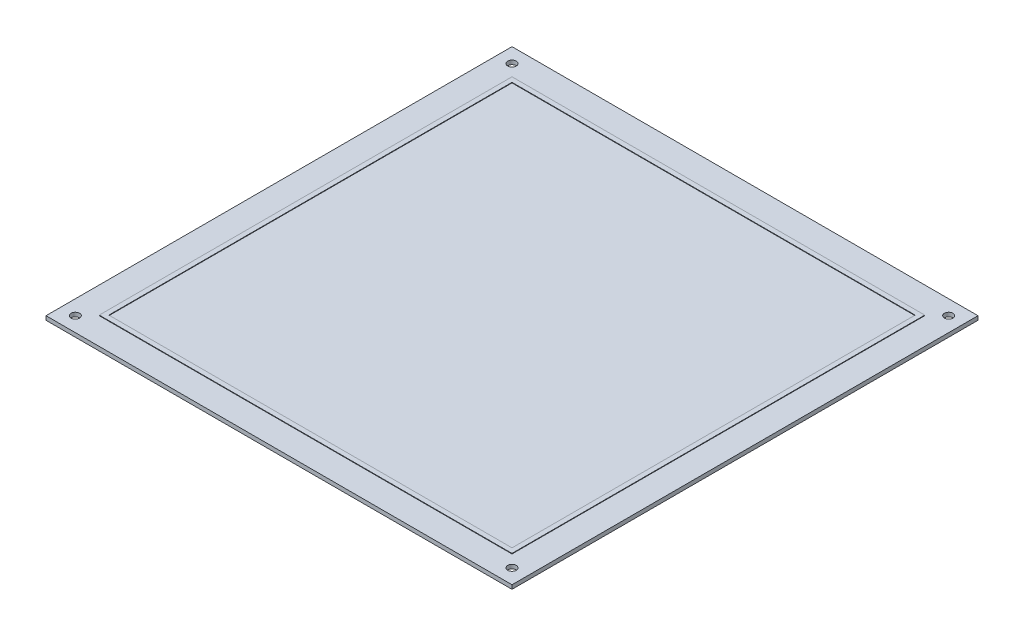
ISO-10303-21;
HEADER;
FILE_DESCRIPTION(('STEP AP214'),'2;1');
FILE_NAME('part.step','',(''),(''),'','','');
FILE_SCHEMA(('AUTOMOTIVE_DESIGN { 1 0 10303 214 1 1 1 1 }'));
ENDSEC;
DATA;
#1=APPLICATION_CONTEXT('core data for automotive mechanical design processes');
#2=APPLICATION_PROTOCOL_DEFINITION('international standard','automotive_design',2000,#1);
#3=PRODUCT_CONTEXT('',#1,'mechanical');
#4=PRODUCT('Part','Part','',(#3));
#5=PRODUCT_RELATED_PRODUCT_CATEGORY('part','',(#4));
#6=PRODUCT_DEFINITION_FORMATION('','',#4);
#7=PRODUCT_DEFINITION_CONTEXT('part definition',#1,'design');
#8=PRODUCT_DEFINITION('design','',#6,#7);
#9=PRODUCT_DEFINITION_SHAPE('','',#8);
#10=(LENGTH_UNIT() NAMED_UNIT(*) SI_UNIT(.MILLI.,.METRE.));
#11=(NAMED_UNIT(*) PLANE_ANGLE_UNIT() SI_UNIT($,.RADIAN.));
#12=(NAMED_UNIT(*) SI_UNIT($,.STERADIAN.) SOLID_ANGLE_UNIT());
#13=UNCERTAINTY_MEASURE_WITH_UNIT(LENGTH_MEASURE(1.E-05),#10,'distance_accuracy_value','');
#14=(GEOMETRIC_REPRESENTATION_CONTEXT(3) GLOBAL_UNCERTAINTY_ASSIGNED_CONTEXT((#13)) GLOBAL_UNIT_ASSIGNED_CONTEXT((#10,
#11,#12)) REPRESENTATION_CONTEXT('',''));
#15=CARTESIAN_POINT('',(0.,0.,0.));
#16=DIRECTION('',(0.,0.,1.));
#17=DIRECTION('',(1.,0.,0.));
#18=AXIS2_PLACEMENT_3D('',#15,#16,#17);
#19=CARTESIAN_POINT('',(0.,1.5,0.));
#20=DIRECTION('',(0.,-1.,0.));
#21=DIRECTION('',(0.,0.,-1.));
#22=AXIS2_PLACEMENT_3D('',#19,#20,#21);
#23=PLANE('',#22);
#24=DIRECTION('',(0.,0.,1.));
#25=VECTOR('',#24,1.);
#26=CARTESIAN_POINT('',(-175.,1.5,175.));
#27=LINE('',#26,#25);
#28=CARTESIAN_POINT('',(-175.,1.5,-175.));
#29=VERTEX_POINT('',#28);
#30=CARTESIAN_POINT('',(-175.,1.5,175.));
#31=VERTEX_POINT('',#30);
#32=EDGE_CURVE('E303',#29,#31,#27,.T.);
#33=ORIENTED_EDGE('',*,*,#32,.T.);
#34=DIRECTION('',(1.,0.,0.));
#35=VECTOR('',#34,1.);
#36=CARTESIAN_POINT('',(-175.,1.5,175.));
#37=LINE('',#36,#35);
#38=CARTESIAN_POINT('',(175.,1.5,175.));
#39=VERTEX_POINT('',#38);
#40=EDGE_CURVE('E306',#31,#39,#37,.T.);
#41=ORIENTED_EDGE('',*,*,#40,.T.);
#42=DIRECTION('',(0.,0.,-1.));
#43=VECTOR('',#42,1.);
#44=CARTESIAN_POINT('',(175.,1.5,175.));
#45=LINE('',#44,#43);
#46=CARTESIAN_POINT('',(175.,1.5,-175.));
#47=VERTEX_POINT('',#46);
#48=EDGE_CURVE('E309',#39,#47,#45,.T.);
#49=ORIENTED_EDGE('',*,*,#48,.T.);
#50=DIRECTION('',(-1.,0.,0.));
#51=VECTOR('',#50,1.);
#52=CARTESIAN_POINT('',(-175.,1.5,-175.));
#53=LINE('',#52,#51);
#54=EDGE_CURVE('E311',#47,#29,#53,.T.);
#55=ORIENTED_EDGE('',*,*,#54,.T.);
#56=EDGE_LOOP('',(#33,#41,#49,#55));
#57=FACE_BOUND('',#56,.T.);
#58=CARTESIAN_POINT('',(164.,1.5,-164.));
#59=DIRECTION('',(0.,1.,0.));
#60=DIRECTION('',(0.,0.,1.));
#61=AXIS2_PLACEMENT_3D('',#58,#59,#60);
#62=CIRCLE('',#61,3.20000000000001);
#63=CARTESIAN_POINT('',(164.,1.5,-160.8));
#64=VERTEX_POINT('',#63);
#65=EDGE_CURVE('E297',#64,#64,#62,.T.);
#66=ORIENTED_EDGE('',*,*,#65,.F.);
#67=EDGE_LOOP('',(#66));
#68=FACE_BOUND('',#67,.T.);
#69=CARTESIAN_POINT('',(-164.,1.5,-164.));
#70=DIRECTION('',(0.,1.,0.));
#71=DIRECTION('',(0.,0.,1.));
#72=AXIS2_PLACEMENT_3D('',#69,#70,#71);
#73=CIRCLE('',#72,3.20000000000001);
#74=CARTESIAN_POINT('',(-164.,1.5,-160.8));
#75=VERTEX_POINT('',#74);
#76=EDGE_CURVE('E291',#75,#75,#73,.T.);
#77=ORIENTED_EDGE('',*,*,#76,.F.);
#78=EDGE_LOOP('',(#77));
#79=FACE_BOUND('',#78,.T.);
#80=CARTESIAN_POINT('',(164.,1.5,164.));
#81=DIRECTION('',(0.,1.,0.));
#82=DIRECTION('',(0.,0.,1.));
#83=AXIS2_PLACEMENT_3D('',#80,#81,#82);
#84=CIRCLE('',#83,3.20000000000001);
#85=CARTESIAN_POINT('',(164.,1.5,167.2));
#86=VERTEX_POINT('',#85);
#87=EDGE_CURVE('E285',#86,#86,#84,.T.);
#88=ORIENTED_EDGE('',*,*,#87,.F.);
#89=EDGE_LOOP('',(#88));
#90=FACE_BOUND('',#89,.T.);
#91=CARTESIAN_POINT('',(-164.,1.5,164.));
#92=DIRECTION('',(0.,1.,0.));
#93=DIRECTION('',(0.,0.,1.));
#94=AXIS2_PLACEMENT_3D('',#91,#92,#93);
#95=CIRCLE('',#94,3.20000000000001);
#96=CARTESIAN_POINT('',(-164.,1.5,167.2));
#97=VERTEX_POINT('',#96);
#98=EDGE_CURVE('E279',#97,#97,#95,.T.);
#99=ORIENTED_EDGE('',*,*,#98,.F.);
#100=EDGE_LOOP('',(#99));
#101=FACE_BOUND('',#100,.T.);
#102=DIRECTION('',(0.,0.,1.));
#103=VECTOR('',#102,1.);
#104=CARTESIAN_POINT('',(-155.,1.5,0.));
#105=LINE('',#104,#103);
#106=CARTESIAN_POINT('',(-155.,1.5,-155.));
#107=VERTEX_POINT('',#106);
#108=CARTESIAN_POINT('',(-155.,1.5,155.));
#109=VERTEX_POINT('',#108);
#110=EDGE_CURVE('E276',#107,#109,#105,.T.);
#111=ORIENTED_EDGE('',*,*,#110,.F.);
#112=DIRECTION('',(-1.,0.,0.));
#113=VECTOR('',#112,1.);
#114=CARTESIAN_POINT('',(0.,1.5,-155.));
#115=LINE('',#114,#113);
#116=CARTESIAN_POINT('',(155.,1.5,-155.));
#117=VERTEX_POINT('',#116);
#118=EDGE_CURVE('E271',#117,#107,#115,.T.);
#119=ORIENTED_EDGE('',*,*,#118,.F.);
#120=DIRECTION('',(0.,0.,-1.));
#121=VECTOR('',#120,1.);
#122=CARTESIAN_POINT('',(155.,1.5,0.));
#123=LINE('',#122,#121);
#124=CARTESIAN_POINT('',(155.,1.5,155.));
#125=VERTEX_POINT('',#124);
#126=EDGE_CURVE('E59',#125,#117,#123,.T.);
#127=ORIENTED_EDGE('',*,*,#126,.F.);
#128=DIRECTION('',(1.,0.,0.));
#129=VECTOR('',#128,1.);
#130=CARTESIAN_POINT('',(0.,1.5,155.));
#131=LINE('',#130,#129);
#132=EDGE_CURVE('E54',#109,#125,#131,.T.);
#133=ORIENTED_EDGE('',*,*,#132,.F.);
#134=EDGE_LOOP('',(#111,#119,#127,#133));
#135=FACE_BOUND('',#134,.T.);
#136=ADVANCED_FACE('F39',(#57,#68,#79,#90,#101,#135),#23,.F.);
#137=CARTESIAN_POINT('',(0.,-1.5,0.));
#138=DIRECTION('',(0.,-1.,0.));
#139=DIRECTION('',(0.,0.,-1.));
#140=AXIS2_PLACEMENT_3D('',#137,#138,#139);
#141=PLANE('',#140);
#142=CARTESIAN_POINT('',(-164.,-1.5,164.));
#143=DIRECTION('',(0.,1.,0.));
#144=DIRECTION('',(0.,0.,1.));
#145=AXIS2_PLACEMENT_3D('',#142,#143,#144);
#146=CIRCLE('',#145,3.20000000000001);
#147=CARTESIAN_POINT('',(-164.,-1.5,167.2));
#148=VERTEX_POINT('',#147);
#149=EDGE_CURVE('E278',#148,#148,#146,.T.);
#150=ORIENTED_EDGE('',*,*,#149,.T.);
#151=EDGE_LOOP('',(#150));
#152=FACE_BOUND('',#151,.T.);
#153=CARTESIAN_POINT('',(-164.,-1.5,-164.));
#154=DIRECTION('',(0.,1.,0.));
#155=DIRECTION('',(0.,0.,1.));
#156=AXIS2_PLACEMENT_3D('',#153,#154,#155);
#157=CIRCLE('',#156,3.20000000000001);
#158=CARTESIAN_POINT('',(-164.,-1.5,-160.8));
#159=VERTEX_POINT('',#158);
#160=EDGE_CURVE('E288',#159,#159,#157,.T.);
#161=ORIENTED_EDGE('',*,*,#160,.T.);
#162=EDGE_LOOP('',(#161));
#163=FACE_BOUND('',#162,.T.);
#164=DIRECTION('',(0.,0.,1.));
#165=VECTOR('',#164,1.);
#166=CARTESIAN_POINT('',(-175.,-1.5,175.));
#167=LINE('',#166,#165);
#168=CARTESIAN_POINT('',(-175.,-1.5,-175.));
#169=VERTEX_POINT('',#168);
#170=CARTESIAN_POINT('',(-175.,-1.5,175.));
#171=VERTEX_POINT('',#170);
#172=EDGE_CURVE('E300',#169,#171,#167,.T.);
#173=ORIENTED_EDGE('',*,*,#172,.F.);
#174=DIRECTION('',(-1.,0.,0.));
#175=VECTOR('',#174,1.);
#176=CARTESIAN_POINT('',(-175.,-1.5,-175.));
#177=LINE('',#176,#175);
#178=CARTESIAN_POINT('',(175.,-1.5,-175.));
#179=VERTEX_POINT('',#178);
#180=EDGE_CURVE('E307',#179,#169,#177,.T.);
#181=ORIENTED_EDGE('',*,*,#180,.F.);
#182=DIRECTION('',(0.,0.,-1.));
#183=VECTOR('',#182,1.);
#184=CARTESIAN_POINT('',(175.,-1.5,175.));
#185=LINE('',#184,#183);
#186=CARTESIAN_POINT('',(175.,-1.5,175.));
#187=VERTEX_POINT('',#186);
#188=EDGE_CURVE('E318',#187,#179,#185,.T.);
#189=ORIENTED_EDGE('',*,*,#188,.F.);
#190=DIRECTION('',(1.,0.,0.));
#191=VECTOR('',#190,1.);
#192=CARTESIAN_POINT('',(-175.,-1.5,175.));
#193=LINE('',#192,#191);
#194=EDGE_CURVE('E316',#171,#187,#193,.T.);
#195=ORIENTED_EDGE('',*,*,#194,.F.);
#196=EDGE_LOOP('',(#173,#181,#189,#195));
#197=FACE_BOUND('',#196,.T.);
#198=CARTESIAN_POINT('',(164.,-1.5,-164.));
#199=DIRECTION('',(0.,1.,0.));
#200=DIRECTION('',(0.,0.,1.));
#201=AXIS2_PLACEMENT_3D('',#198,#199,#200);
#202=CIRCLE('',#201,3.20000000000001);
#203=CARTESIAN_POINT('',(164.,-1.5,-160.8));
#204=VERTEX_POINT('',#203);
#205=EDGE_CURVE('E294',#204,#204,#202,.T.);
#206=ORIENTED_EDGE('',*,*,#205,.T.);
#207=EDGE_LOOP('',(#206));
#208=FACE_BOUND('',#207,.T.);
#209=CARTESIAN_POINT('',(164.,-1.5,164.));
#210=DIRECTION('',(0.,1.,0.));
#211=DIRECTION('',(0.,0.,1.));
#212=AXIS2_PLACEMENT_3D('',#209,#210,#211);
#213=CIRCLE('',#212,3.20000000000001);
#214=CARTESIAN_POINT('',(164.,-1.5,167.2));
#215=VERTEX_POINT('',#214);
#216=EDGE_CURVE('E282',#215,#215,#213,.T.);
#217=ORIENTED_EDGE('',*,*,#216,.T.);
#218=EDGE_LOOP('',(#217));
#219=FACE_BOUND('',#218,.T.);
#220=DIRECTION('',(-1.,0.,0.));
#221=VECTOR('',#220,1.);
#222=CARTESIAN_POINT('',(0.,-1.5,-155.));
#223=LINE('',#222,#221);
#224=CARTESIAN_POINT('',(155.,-1.5,-155.));
#225=VERTEX_POINT('',#224);
#226=CARTESIAN_POINT('',(-155.,-1.5,-155.));
#227=VERTEX_POINT('',#226);
#228=EDGE_CURVE('E344',#225,#227,#223,.T.);
#229=ORIENTED_EDGE('',*,*,#228,.T.);
#230=DIRECTION('',(0.,0.,1.));
#231=VECTOR('',#230,1.);
#232=CARTESIAN_POINT('',(-155.,-1.5,0.));
#233=LINE('',#232,#231);
#234=CARTESIAN_POINT('',(-155.,-1.5,155.));
#235=VERTEX_POINT('',#234);
#236=EDGE_CURVE('E11',#227,#235,#233,.T.);
#237=ORIENTED_EDGE('',*,*,#236,.T.);
#238=DIRECTION('',(1.,0.,0.));
#239=VECTOR('',#238,1.);
#240=CARTESIAN_POINT('',(0.,-1.5,155.));
#241=LINE('',#240,#239);
#242=CARTESIAN_POINT('',(155.,-1.5,155.));
#243=VERTEX_POINT('',#242);
#244=EDGE_CURVE('E47',#235,#243,#241,.T.);
#245=ORIENTED_EDGE('',*,*,#244,.T.);
#246=DIRECTION('',(0.,0.,-1.));
#247=VECTOR('',#246,1.);
#248=CARTESIAN_POINT('',(155.,-1.5,0.));
#249=LINE('',#248,#247);
#250=EDGE_CURVE('E347',#243,#225,#249,.T.);
#251=ORIENTED_EDGE('',*,*,#250,.T.);
#252=EDGE_LOOP('',(#229,#237,#245,#251));
#253=FACE_BOUND('',#252,.T.);
#254=ADVANCED_FACE('F351',(#152,#163,#197,#208,#219,#253),#141,.T.);
#255=CARTESIAN_POINT('',(-175.,1.5,175.));
#256=DIRECTION('',(1.,0.,0.));
#257=DIRECTION('',(0.,0.,-1.));
#258=AXIS2_PLACEMENT_3D('',#255,#256,#257);
#259=PLANE('',#258);
#260=ORIENTED_EDGE('',*,*,#172,.T.);
#261=DIRECTION('',(0.,-1.,0.));
#262=VECTOR('',#261,1.);
#263=CARTESIAN_POINT('',(-175.,1.5,175.));
#264=LINE('',#263,#262);
#265=EDGE_CURVE('E329',#31,#171,#264,.T.);
#266=ORIENTED_EDGE('',*,*,#265,.F.);
#267=ORIENTED_EDGE('',*,*,#32,.F.);
#268=DIRECTION('',(0.,-1.,0.));
#269=VECTOR('',#268,1.);
#270=CARTESIAN_POINT('',(-175.,1.5,-175.));
#271=LINE('',#270,#269);
#272=EDGE_CURVE('E313',#29,#169,#271,.T.);
#273=ORIENTED_EDGE('',*,*,#272,.T.);
#274=EDGE_LOOP('',(#260,#266,#267,#273));
#275=FACE_BOUND('',#274,.T.);
#276=ADVANCED_FACE('F41',(#275),#259,.F.);
#277=CARTESIAN_POINT('',(-175.,1.5,175.));
#278=DIRECTION('',(0.,0.,-1.));
#279=DIRECTION('',(-1.,0.,0.));
#280=AXIS2_PLACEMENT_3D('',#277,#278,#279);
#281=PLANE('',#280);
#282=ORIENTED_EDGE('',*,*,#194,.T.);
#283=DIRECTION('',(0.,-1.,0.));
#284=VECTOR('',#283,1.);
#285=CARTESIAN_POINT('',(175.,1.5,175.));
#286=LINE('',#285,#284);
#287=EDGE_CURVE('E326',#39,#187,#286,.T.);
#288=ORIENTED_EDGE('',*,*,#287,.F.);
#289=ORIENTED_EDGE('',*,*,#40,.F.);
#290=ORIENTED_EDGE('',*,*,#265,.T.);
#291=EDGE_LOOP('',(#282,#288,#289,#290));
#292=FACE_BOUND('',#291,.T.);
#293=ADVANCED_FACE('F605',(#292),#281,.F.);
#294=CARTESIAN_POINT('',(175.,1.5,175.));
#295=DIRECTION('',(-1.,0.,0.));
#296=DIRECTION('',(0.,0.,1.));
#297=AXIS2_PLACEMENT_3D('',#294,#295,#296);
#298=PLANE('',#297);
#299=ORIENTED_EDGE('',*,*,#188,.T.);
#300=DIRECTION('',(0.,-1.,0.));
#301=VECTOR('',#300,1.);
#302=CARTESIAN_POINT('',(175.,1.5,-175.));
#303=LINE('',#302,#301);
#304=EDGE_CURVE('E323',#47,#179,#303,.T.);
#305=ORIENTED_EDGE('',*,*,#304,.F.);
#306=ORIENTED_EDGE('',*,*,#48,.F.);
#307=ORIENTED_EDGE('',*,*,#287,.T.);
#308=EDGE_LOOP('',(#299,#305,#306,#307));
#309=FACE_BOUND('',#308,.T.);
#310=ADVANCED_FACE('F596',(#309),#298,.F.);
#311=CARTESIAN_POINT('',(-175.,1.5,-175.));
#312=DIRECTION('',(0.,0.,1.));
#313=DIRECTION('',(1.,0.,0.));
#314=AXIS2_PLACEMENT_3D('',#311,#312,#313);
#315=PLANE('',#314);
#316=ORIENTED_EDGE('',*,*,#180,.T.);
#317=ORIENTED_EDGE('',*,*,#272,.F.);
#318=ORIENTED_EDGE('',*,*,#54,.F.);
#319=ORIENTED_EDGE('',*,*,#304,.T.);
#320=EDGE_LOOP('',(#316,#317,#318,#319));
#321=FACE_BOUND('',#320,.T.);
#322=ADVANCED_FACE('F588',(#321),#315,.F.);
#323=CARTESIAN_POINT('',(164.,1.5,-164.));
#324=DIRECTION('',(0.,-1.,0.));
#325=DIRECTION('',(0.,0.,-1.));
#326=AXIS2_PLACEMENT_3D('',#323,#324,#325);
#327=CYLINDRICAL_SURFACE('',#326,3.20000000000001);
#328=ORIENTED_EDGE('',*,*,#65,.T.);
#329=EDGE_LOOP('',(#328));
#330=FACE_BOUND('',#329,.T.);
#331=ORIENTED_EDGE('',*,*,#205,.F.);
#332=EDGE_LOOP('',(#331));
#333=FACE_BOUND('',#332,.T.);
#334=ADVANCED_FACE('F579',(#330,#333),#327,.F.);
#335=CARTESIAN_POINT('',(-164.,1.5,-164.));
#336=DIRECTION('',(0.,-1.,0.));
#337=DIRECTION('',(0.,0.,-1.));
#338=AXIS2_PLACEMENT_3D('',#335,#336,#337);
#339=CYLINDRICAL_SURFACE('',#338,3.20000000000001);
#340=ORIENTED_EDGE('',*,*,#76,.T.);
#341=EDGE_LOOP('',(#340));
#342=FACE_BOUND('',#341,.T.);
#343=ORIENTED_EDGE('',*,*,#160,.F.);
#344=EDGE_LOOP('',(#343));
#345=FACE_BOUND('',#344,.T.);
#346=ADVANCED_FACE('F570',(#342,#345),#339,.F.);
#347=CARTESIAN_POINT('',(164.,1.5,164.));
#348=DIRECTION('',(0.,-1.,0.));
#349=DIRECTION('',(0.,0.,-1.));
#350=AXIS2_PLACEMENT_3D('',#347,#348,#349);
#351=CYLINDRICAL_SURFACE('',#350,3.20000000000001);
#352=ORIENTED_EDGE('',*,*,#87,.T.);
#353=EDGE_LOOP('',(#352));
#354=FACE_BOUND('',#353,.T.);
#355=ORIENTED_EDGE('',*,*,#216,.F.);
#356=EDGE_LOOP('',(#355));
#357=FACE_BOUND('',#356,.T.);
#358=ADVANCED_FACE('F382',(#354,#357),#351,.F.);
#359=CARTESIAN_POINT('',(-164.,1.5,164.));
#360=DIRECTION('',(0.,-1.,0.));
#361=DIRECTION('',(0.,0.,-1.));
#362=AXIS2_PLACEMENT_3D('',#359,#360,#361);
#363=CYLINDRICAL_SURFACE('',#362,3.20000000000001);
#364=ORIENTED_EDGE('',*,*,#98,.T.);
#365=EDGE_LOOP('',(#364));
#366=FACE_BOUND('',#365,.T.);
#367=ORIENTED_EDGE('',*,*,#149,.F.);
#368=EDGE_LOOP('',(#367));
#369=FACE_BOUND('',#368,.T.);
#370=ADVANCED_FACE('F372',(#366,#369),#363,.F.);
#371=CARTESIAN_POINT('',(-155.,1.9,-155.));
#372=DIRECTION('',(0.,0.,1.));
#373=DIRECTION('',(1.,0.,0.));
#374=AXIS2_PLACEMENT_3D('',#371,#372,#373);
#375=PLANE('',#374);
#376=ORIENTED_EDGE('',*,*,#228,.F.);
#377=DIRECTION('',(0.,-1.,0.));
#378=VECTOR('',#377,1.);
#379=CARTESIAN_POINT('',(155.,1.9,-155.));
#380=LINE('',#379,#378);
#381=CARTESIAN_POINT('',(155.,-1.9,-155.));
#382=VERTEX_POINT('',#381);
#383=EDGE_CURVE('E250',#225,#382,#380,.T.);
#384=ORIENTED_EDGE('',*,*,#383,.T.);
#385=DIRECTION('',(-1.,0.,0.));
#386=VECTOR('',#385,1.);
#387=CARTESIAN_POINT('',(-155.,-1.9,-155.));
#388=LINE('',#387,#386);
#389=CARTESIAN_POINT('',(-155.,-1.9,-155.));
#390=VERTEX_POINT('',#389);
#391=EDGE_CURVE('E230',#382,#390,#388,.T.);
#392=ORIENTED_EDGE('',*,*,#391,.T.);
#393=DIRECTION('',(0.,-1.,0.));
#394=VECTOR('',#393,1.);
#395=CARTESIAN_POINT('',(-155.,1.9,-155.));
#396=LINE('',#395,#394);
#397=EDGE_CURVE('E236',#227,#390,#396,.T.);
#398=ORIENTED_EDGE('',*,*,#397,.F.);
#399=EDGE_LOOP('',(#376,#384,#392,#398));
#400=FACE_BOUND('',#399,.T.);
#401=ADVANCED_FACE('F370',(#400),#375,.F.);
#402=CARTESIAN_POINT('',(155.,1.9,155.));
#403=DIRECTION('',(-1.,0.,0.));
#404=DIRECTION('',(0.,0.,1.));
#405=AXIS2_PLACEMENT_3D('',#402,#403,#404);
#406=PLANE('',#405);
#407=ORIENTED_EDGE('',*,*,#250,.F.);
#408=DIRECTION('',(0.,-1.,0.));
#409=VECTOR('',#408,1.);
#410=CARTESIAN_POINT('',(155.,1.9,155.));
#411=LINE('',#410,#409);
#412=CARTESIAN_POINT('',(155.,-1.9,155.));
#413=VERTEX_POINT('',#412);
#414=EDGE_CURVE('E254',#243,#413,#411,.T.);
#415=ORIENTED_EDGE('',*,*,#414,.T.);
#416=DIRECTION('',(0.,0.,-1.));
#417=VECTOR('',#416,1.);
#418=CARTESIAN_POINT('',(155.,-1.9,155.));
#419=LINE('',#418,#417);
#420=EDGE_CURVE('E242',#413,#382,#419,.T.);
#421=ORIENTED_EDGE('',*,*,#420,.T.);
#422=ORIENTED_EDGE('',*,*,#383,.F.);
#423=EDGE_LOOP('',(#407,#415,#421,#422));
#424=FACE_BOUND('',#423,.T.);
#425=ADVANCED_FACE('F368',(#424),#406,.F.);
#426=CARTESIAN_POINT('',(-155.,1.9,155.));
#427=DIRECTION('',(0.,0.,-1.));
#428=DIRECTION('',(-1.,0.,0.));
#429=AXIS2_PLACEMENT_3D('',#426,#427,#428);
#430=PLANE('',#429);
#431=ORIENTED_EDGE('',*,*,#244,.F.);
#432=DIRECTION('',(0.,-1.,0.));
#433=VECTOR('',#432,1.);
#434=CARTESIAN_POINT('',(-155.,1.9,155.));
#435=LINE('',#434,#433);
#436=CARTESIAN_POINT('',(-155.,-1.9,155.));
#437=VERTEX_POINT('',#436);
#438=EDGE_CURVE('E258',#235,#437,#435,.T.);
#439=ORIENTED_EDGE('',*,*,#438,.T.);
#440=DIRECTION('',(1.,0.,0.));
#441=VECTOR('',#440,1.);
#442=CARTESIAN_POINT('',(-155.,-1.9,155.));
#443=LINE('',#442,#441);
#444=EDGE_CURVE('E239',#437,#413,#443,.T.);
#445=ORIENTED_EDGE('',*,*,#444,.T.);
#446=ORIENTED_EDGE('',*,*,#414,.F.);
#447=EDGE_LOOP('',(#431,#439,#445,#446));
#448=FACE_BOUND('',#447,.T.);
#449=ADVANCED_FACE('F356',(#448),#430,.F.);
#450=CARTESIAN_POINT('',(-155.,1.9,155.));
#451=DIRECTION('',(1.,0.,0.));
#452=DIRECTION('',(0.,0.,-1.));
#453=AXIS2_PLACEMENT_3D('',#450,#451,#452);
#454=PLANE('',#453);
#455=ORIENTED_EDGE('',*,*,#236,.F.);
#456=ORIENTED_EDGE('',*,*,#397,.T.);
#457=DIRECTION('',(0.,0.,1.));
#458=VECTOR('',#457,1.);
#459=CARTESIAN_POINT('',(-155.,-1.9,155.));
#460=LINE('',#459,#458);
#461=EDGE_CURVE('E194',#390,#437,#460,.T.);
#462=ORIENTED_EDGE('',*,*,#461,.T.);
#463=ORIENTED_EDGE('',*,*,#438,.F.);
#464=EDGE_LOOP('',(#455,#456,#462,#463));
#465=FACE_BOUND('',#464,.T.);
#466=ADVANCED_FACE('F359',(#465),#454,.F.);
#467=CARTESIAN_POINT('',(0.,-1.9,0.));
#468=DIRECTION('',(0.,-1.,0.));
#469=DIRECTION('',(0.,0.,-1.));
#470=AXIS2_PLACEMENT_3D('',#467,#468,#469);
#471=PLANE('',#470);
#472=ORIENTED_EDGE('',*,*,#461,.F.);
#473=ORIENTED_EDGE('',*,*,#391,.F.);
#474=ORIENTED_EDGE('',*,*,#420,.F.);
#475=ORIENTED_EDGE('',*,*,#444,.F.);
#476=EDGE_LOOP('',(#472,#473,#474,#475));
#477=FACE_BOUND('',#476,.T.);
#478=DIRECTION('',(-1.,0.,0.));
#479=VECTOR('',#478,1.);
#480=CARTESIAN_POINT('',(-151.4,-1.9,-151.4));
#481=LINE('',#480,#479);
#482=CARTESIAN_POINT('',(151.4,-1.9,-151.4));
#483=VERTEX_POINT('',#482);
#484=CARTESIAN_POINT('',(-151.4,-1.9,-151.4));
#485=VERTEX_POINT('',#484);
#486=EDGE_CURVE('E186',#483,#485,#481,.T.);
#487=ORIENTED_EDGE('',*,*,#486,.T.);
#488=DIRECTION('',(0.,0.,1.));
#489=VECTOR('',#488,1.);
#490=CARTESIAN_POINT('',(-151.4,-1.9,151.4));
#491=LINE('',#490,#489);
#492=CARTESIAN_POINT('',(-151.4,-1.9,151.4));
#493=VERTEX_POINT('',#492);
#494=EDGE_CURVE('E207',#485,#493,#491,.T.);
#495=ORIENTED_EDGE('',*,*,#494,.T.);
#496=DIRECTION('',(1.,0.,0.));
#497=VECTOR('',#496,1.);
#498=CARTESIAN_POINT('',(-151.4,-1.9,151.4));
#499=LINE('',#498,#497);
#500=CARTESIAN_POINT('',(151.4,-1.9,151.4));
#501=VERTEX_POINT('',#500);
#502=EDGE_CURVE('E210',#493,#501,#499,.T.);
#503=ORIENTED_EDGE('',*,*,#502,.T.);
#504=DIRECTION('',(0.,0.,-1.));
#505=VECTOR('',#504,1.);
#506=CARTESIAN_POINT('',(151.4,-1.9,151.4));
#507=LINE('',#506,#505);
#508=EDGE_CURVE('E213',#501,#483,#507,.T.);
#509=ORIENTED_EDGE('',*,*,#508,.T.);
#510=EDGE_LOOP('',(#487,#495,#503,#509));
#511=FACE_BOUND('',#510,.T.);
#512=ADVANCED_FACE('F363',(#477,#511),#471,.T.);
#513=CARTESIAN_POINT('',(-151.4,1.9,-151.4));
#514=DIRECTION('',(0.,0.,1.));
#515=DIRECTION('',(1.,0.,0.));
#516=AXIS2_PLACEMENT_3D('',#513,#514,#515);
#517=PLANE('',#516);
#518=DIRECTION('',(0.,-1.,0.));
#519=VECTOR('',#518,1.);
#520=CARTESIAN_POINT('',(151.4,1.9,-151.4));
#521=LINE('',#520,#519);
#522=CARTESIAN_POINT('',(151.4,-1.5,-151.4));
#523=VERTEX_POINT('',#522);
#524=EDGE_CURVE('E219',#523,#483,#521,.T.);
#525=ORIENTED_EDGE('',*,*,#524,.F.);
#526=DIRECTION('',(-1.,0.,0.));
#527=VECTOR('',#526,1.);
#528=CARTESIAN_POINT('',(0.,-1.5,-151.4));
#529=LINE('',#528,#527);
#530=CARTESIAN_POINT('',(-151.4,-1.5,-151.4));
#531=VERTEX_POINT('',#530);
#532=EDGE_CURVE('E332',#523,#531,#529,.T.);
#533=ORIENTED_EDGE('',*,*,#532,.T.);
#534=DIRECTION('',(0.,-1.,0.));
#535=VECTOR('',#534,1.);
#536=CARTESIAN_POINT('',(-151.4,1.9,-151.4));
#537=LINE('',#536,#535);
#538=EDGE_CURVE('E206',#531,#485,#537,.T.);
#539=ORIENTED_EDGE('',*,*,#538,.T.);
#540=ORIENTED_EDGE('',*,*,#486,.F.);
#541=EDGE_LOOP('',(#525,#533,#539,#540));
#542=FACE_BOUND('',#541,.T.);
#543=ADVANCED_FACE('F418',(#542),#517,.T.);
#544=CARTESIAN_POINT('',(151.4,1.9,151.4));
#545=DIRECTION('',(-1.,0.,0.));
#546=DIRECTION('',(0.,0.,1.));
#547=AXIS2_PLACEMENT_3D('',#544,#545,#546);
#548=PLANE('',#547);
#549=DIRECTION('',(0.,-1.,0.));
#550=VECTOR('',#549,1.);
#551=CARTESIAN_POINT('',(151.4,1.9,151.4));
#552=LINE('',#551,#550);
#553=CARTESIAN_POINT('',(151.4,-1.5,151.4));
#554=VERTEX_POINT('',#553);
#555=EDGE_CURVE('E223',#554,#501,#552,.T.);
#556=ORIENTED_EDGE('',*,*,#555,.F.);
#557=DIRECTION('',(0.,0.,-1.));
#558=VECTOR('',#557,1.);
#559=CARTESIAN_POINT('',(151.4,-1.5,0.));
#560=LINE('',#559,#558);
#561=EDGE_CURVE('E335',#554,#523,#560,.T.);
#562=ORIENTED_EDGE('',*,*,#561,.T.);
#563=ORIENTED_EDGE('',*,*,#524,.T.);
#564=ORIENTED_EDGE('',*,*,#508,.F.);
#565=EDGE_LOOP('',(#556,#562,#563,#564));
#566=FACE_BOUND('',#565,.T.);
#567=ADVANCED_FACE('F412',(#566),#548,.T.);
#568=CARTESIAN_POINT('',(-151.4,1.9,151.4));
#569=DIRECTION('',(0.,0.,-1.));
#570=DIRECTION('',(-1.,0.,0.));
#571=AXIS2_PLACEMENT_3D('',#568,#569,#570);
#572=PLANE('',#571);
#573=DIRECTION('',(0.,-1.,0.));
#574=VECTOR('',#573,1.);
#575=CARTESIAN_POINT('',(-151.4,1.9,151.4));
#576=LINE('',#575,#574);
#577=CARTESIAN_POINT('',(-151.4,-1.5,151.4));
#578=VERTEX_POINT('',#577);
#579=EDGE_CURVE('E195',#578,#493,#576,.T.);
#580=ORIENTED_EDGE('',*,*,#579,.F.);
#581=DIRECTION('',(1.,0.,0.));
#582=VECTOR('',#581,1.);
#583=CARTESIAN_POINT('',(0.,-1.5,151.4));
#584=LINE('',#583,#582);
#585=EDGE_CURVE('E338',#578,#554,#584,.T.);
#586=ORIENTED_EDGE('',*,*,#585,.T.);
#587=ORIENTED_EDGE('',*,*,#555,.T.);
#588=ORIENTED_EDGE('',*,*,#502,.F.);
#589=EDGE_LOOP('',(#580,#586,#587,#588));
#590=FACE_BOUND('',#589,.T.);
#591=ADVANCED_FACE('F420',(#590),#572,.T.);
#592=CARTESIAN_POINT('',(-151.4,1.9,151.4));
#593=DIRECTION('',(1.,0.,0.));
#594=DIRECTION('',(0.,0.,-1.));
#595=AXIS2_PLACEMENT_3D('',#592,#593,#594);
#596=PLANE('',#595);
#597=ORIENTED_EDGE('',*,*,#538,.F.);
#598=DIRECTION('',(0.,0.,1.));
#599=VECTOR('',#598,1.);
#600=CARTESIAN_POINT('',(-151.4,-1.5,0.));
#601=LINE('',#600,#599);
#602=EDGE_CURVE('E341',#531,#578,#601,.T.);
#603=ORIENTED_EDGE('',*,*,#602,.T.);
#604=ORIENTED_EDGE('',*,*,#579,.T.);
#605=ORIENTED_EDGE('',*,*,#494,.F.);
#606=EDGE_LOOP('',(#597,#603,#604,#605));
#607=FACE_BOUND('',#606,.T.);
#608=ADVANCED_FACE('F427',(#607),#596,.T.);
#609=ORIENTED_EDGE('',*,*,#602,.F.);
#610=ORIENTED_EDGE('',*,*,#532,.F.);
#611=ORIENTED_EDGE('',*,*,#561,.F.);
#612=ORIENTED_EDGE('',*,*,#585,.F.);
#613=EDGE_LOOP('',(#609,#610,#611,#612));
#614=FACE_BOUND('',#613,.T.);
#615=ADVANCED_FACE('F396',(#614),#141,.T.);
#616=CARTESIAN_POINT('',(-155.,1.9,-155.));
#617=VERTEX_POINT('',#616);
#618=EDGE_CURVE('E247',#617,#107,#396,.T.);
#619=ORIENTED_EDGE('',*,*,#618,.T.);
#620=ORIENTED_EDGE('',*,*,#110,.T.);
#621=CARTESIAN_POINT('',(-155.,1.9,155.));
#622=VERTEX_POINT('',#621);
#623=EDGE_CURVE('E259',#622,#109,#435,.T.);
#624=ORIENTED_EDGE('',*,*,#623,.F.);
#625=DIRECTION('',(0.,0.,1.));
#626=VECTOR('',#625,1.);
#627=CARTESIAN_POINT('',(-155.,1.9,155.));
#628=LINE('',#627,#626);
#629=EDGE_CURVE('E226',#617,#622,#628,.T.);
#630=ORIENTED_EDGE('',*,*,#629,.F.);
#631=EDGE_LOOP('',(#619,#620,#624,#630));
#632=FACE_BOUND('',#631,.T.);
#633=ADVANCED_FACE('F445',(#632),#454,.F.);
#634=ORIENTED_EDGE('',*,*,#623,.T.);
#635=ORIENTED_EDGE('',*,*,#132,.T.);
#636=CARTESIAN_POINT('',(155.,1.9,155.));
#637=VERTEX_POINT('',#636);
#638=EDGE_CURVE('E255',#637,#125,#411,.T.);
#639=ORIENTED_EDGE('',*,*,#638,.F.);
#640=DIRECTION('',(1.,0.,0.));
#641=VECTOR('',#640,1.);
#642=CARTESIAN_POINT('',(-155.,1.9,155.));
#643=LINE('',#642,#641);
#644=EDGE_CURVE('E229',#622,#637,#643,.T.);
#645=ORIENTED_EDGE('',*,*,#644,.F.);
#646=EDGE_LOOP('',(#634,#635,#639,#645));
#647=FACE_BOUND('',#646,.T.);
#648=ADVANCED_FACE('F491',(#647),#430,.F.);
#649=ORIENTED_EDGE('',*,*,#638,.T.);
#650=ORIENTED_EDGE('',*,*,#126,.T.);
#651=CARTESIAN_POINT('',(155.,1.9,-155.));
#652=VERTEX_POINT('',#651);
#653=EDGE_CURVE('E251',#652,#117,#380,.T.);
#654=ORIENTED_EDGE('',*,*,#653,.F.);
#655=DIRECTION('',(0.,0.,-1.));
#656=VECTOR('',#655,1.);
#657=CARTESIAN_POINT('',(155.,1.9,155.));
#658=LINE('',#657,#656);
#659=EDGE_CURVE('E232',#637,#652,#658,.T.);
#660=ORIENTED_EDGE('',*,*,#659,.F.);
#661=EDGE_LOOP('',(#649,#650,#654,#660));
#662=FACE_BOUND('',#661,.T.);
#663=ADVANCED_FACE('F380',(#662),#406,.F.);
#664=ORIENTED_EDGE('',*,*,#653,.T.);
#665=ORIENTED_EDGE('',*,*,#118,.T.);
#666=ORIENTED_EDGE('',*,*,#618,.F.);
#667=DIRECTION('',(-1.,0.,0.));
#668=VECTOR('',#667,1.);
#669=CARTESIAN_POINT('',(-155.,1.9,-155.));
#670=LINE('',#669,#668);
#671=EDGE_CURVE('E234',#652,#617,#670,.T.);
#672=ORIENTED_EDGE('',*,*,#671,.F.);
#673=EDGE_LOOP('',(#664,#665,#666,#672));
#674=FACE_BOUND('',#673,.T.);
#675=ADVANCED_FACE('F374',(#674),#375,.F.);
#676=DIRECTION('',(0.,0.,1.));
#677=VECTOR('',#676,1.);
#678=CARTESIAN_POINT('',(-151.4,1.5,0.));
#679=LINE('',#678,#677);
#680=CARTESIAN_POINT('',(-151.4,1.5,-151.4));
#681=VERTEX_POINT('',#680);
#682=CARTESIAN_POINT('',(-151.4,1.5,151.4));
#683=VERTEX_POINT('',#682);
#684=EDGE_CURVE('E269',#681,#683,#679,.T.);
#685=ORIENTED_EDGE('',*,*,#684,.F.);
#686=CARTESIAN_POINT('',(-151.4,1.9,-151.4));
#687=VERTEX_POINT('',#686);
#688=EDGE_CURVE('E181',#687,#681,#537,.T.);
#689=ORIENTED_EDGE('',*,*,#688,.F.);
#690=DIRECTION('',(0.,0.,1.));
#691=VECTOR('',#690,1.);
#692=CARTESIAN_POINT('',(-151.4,1.9,151.4));
#693=LINE('',#692,#691);
#694=CARTESIAN_POINT('',(-151.4,1.9,151.4));
#695=VERTEX_POINT('',#694);
#696=EDGE_CURVE('E175',#687,#695,#693,.T.);
#697=ORIENTED_EDGE('',*,*,#696,.T.);
#698=EDGE_CURVE('E179',#695,#683,#576,.T.);
#699=ORIENTED_EDGE('',*,*,#698,.T.);
#700=EDGE_LOOP('',(#685,#689,#697,#699));
#701=FACE_BOUND('',#700,.T.);
#702=ADVANCED_FACE('F178',(#701),#596,.T.);
#703=DIRECTION('',(1.,0.,0.));
#704=VECTOR('',#703,1.);
#705=CARTESIAN_POINT('',(0.,1.5,151.4));
#706=LINE('',#705,#704);
#707=CARTESIAN_POINT('',(151.4,1.5,151.4));
#708=VERTEX_POINT('',#707);
#709=EDGE_CURVE('E193',#683,#708,#706,.T.);
#710=ORIENTED_EDGE('',*,*,#709,.F.);
#711=ORIENTED_EDGE('',*,*,#698,.F.);
#712=DIRECTION('',(1.,0.,0.));
#713=VECTOR('',#712,1.);
#714=CARTESIAN_POINT('',(-151.4,1.9,151.4));
#715=LINE('',#714,#713);
#716=CARTESIAN_POINT('',(151.4,1.9,151.4));
#717=VERTEX_POINT('',#716);
#718=EDGE_CURVE('E185',#695,#717,#715,.T.);
#719=ORIENTED_EDGE('',*,*,#718,.T.);
#720=EDGE_CURVE('E224',#717,#708,#552,.T.);
#721=ORIENTED_EDGE('',*,*,#720,.T.);
#722=EDGE_LOOP('',(#710,#711,#719,#721));
#723=FACE_BOUND('',#722,.T.);
#724=ADVANCED_FACE('F189',(#723),#572,.T.);
#725=DIRECTION('',(0.,0.,-1.));
#726=VECTOR('',#725,1.);
#727=CARTESIAN_POINT('',(151.4,1.5,0.));
#728=LINE('',#727,#726);
#729=CARTESIAN_POINT('',(151.4,1.5,-151.4));
#730=VERTEX_POINT('',#729);
#731=EDGE_CURVE('E265',#708,#730,#728,.T.);
#732=ORIENTED_EDGE('',*,*,#731,.F.);
#733=ORIENTED_EDGE('',*,*,#720,.F.);
#734=DIRECTION('',(0.,0.,-1.));
#735=VECTOR('',#734,1.);
#736=CARTESIAN_POINT('',(151.4,1.9,151.4));
#737=LINE('',#736,#735);
#738=CARTESIAN_POINT('',(151.4,1.9,-151.4));
#739=VERTEX_POINT('',#738);
#740=EDGE_CURVE('E200',#717,#739,#737,.T.);
#741=ORIENTED_EDGE('',*,*,#740,.T.);
#742=EDGE_CURVE('E220',#739,#730,#521,.T.);
#743=ORIENTED_EDGE('',*,*,#742,.T.);
#744=EDGE_LOOP('',(#732,#733,#741,#743));
#745=FACE_BOUND('',#744,.T.);
#746=ADVANCED_FACE('F409',(#745),#548,.T.);
#747=DIRECTION('',(-1.,0.,0.));
#748=VECTOR('',#747,1.);
#749=CARTESIAN_POINT('',(0.,1.5,-151.4));
#750=LINE('',#749,#748);
#751=EDGE_CURVE('E262',#730,#681,#750,.T.);
#752=ORIENTED_EDGE('',*,*,#751,.F.);
#753=ORIENTED_EDGE('',*,*,#742,.F.);
#754=DIRECTION('',(-1.,0.,0.));
#755=VECTOR('',#754,1.);
#756=CARTESIAN_POINT('',(-151.4,1.9,-151.4));
#757=LINE('',#756,#755);
#758=EDGE_CURVE('E202',#739,#687,#757,.T.);
#759=ORIENTED_EDGE('',*,*,#758,.T.);
#760=ORIENTED_EDGE('',*,*,#688,.T.);
#761=EDGE_LOOP('',(#752,#753,#759,#760));
#762=FACE_BOUND('',#761,.T.);
#763=ADVANCED_FACE('F404',(#762),#517,.T.);
#764=CARTESIAN_POINT('',(0.,1.9,0.));
#765=DIRECTION('',(0.,-1.,0.));
#766=DIRECTION('',(0.,0.,-1.));
#767=AXIS2_PLACEMENT_3D('',#764,#765,#766);
#768=PLANE('',#767);
#769=ORIENTED_EDGE('',*,*,#629,.T.);
#770=ORIENTED_EDGE('',*,*,#644,.T.);
#771=ORIENTED_EDGE('',*,*,#659,.T.);
#772=ORIENTED_EDGE('',*,*,#671,.T.);
#773=EDGE_LOOP('',(#769,#770,#771,#772));
#774=FACE_BOUND('',#773,.T.);
#775=ORIENTED_EDGE('',*,*,#696,.F.);
#776=ORIENTED_EDGE('',*,*,#758,.F.);
#777=ORIENTED_EDGE('',*,*,#740,.F.);
#778=ORIENTED_EDGE('',*,*,#718,.F.);
#779=EDGE_LOOP('',(#775,#776,#777,#778));
#780=FACE_BOUND('',#779,.T.);
#781=ADVANCED_FACE('F198',(#774,#780),#768,.F.);
#782=ORIENTED_EDGE('',*,*,#751,.T.);
#783=ORIENTED_EDGE('',*,*,#684,.T.);
#784=ORIENTED_EDGE('',*,*,#709,.T.);
#785=ORIENTED_EDGE('',*,*,#731,.T.);
#786=EDGE_LOOP('',(#782,#783,#784,#785));
#787=FACE_BOUND('',#786,.T.);
#788=ADVANCED_FACE('F391',(#787),#23,.F.);
#789=CLOSED_SHELL('',(#136,#254,#276,#293,#310,#322,#334,#346,#358,#370,#401,#425,#449,#466,
#512,#543,#567,#591,#608,#615,#633,#648,#663,#675,#702,#724,#746,#763,#781,#788));
#790=MANIFOLD_SOLID_BREP('B2',#789);
#791=ADVANCED_BREP_SHAPE_REPRESENTATION('',(#18,#790),#14);
#792=SHAPE_DEFINITION_REPRESENTATION(#9,#791);
ENDSEC;
END-ISO-10303-21;
